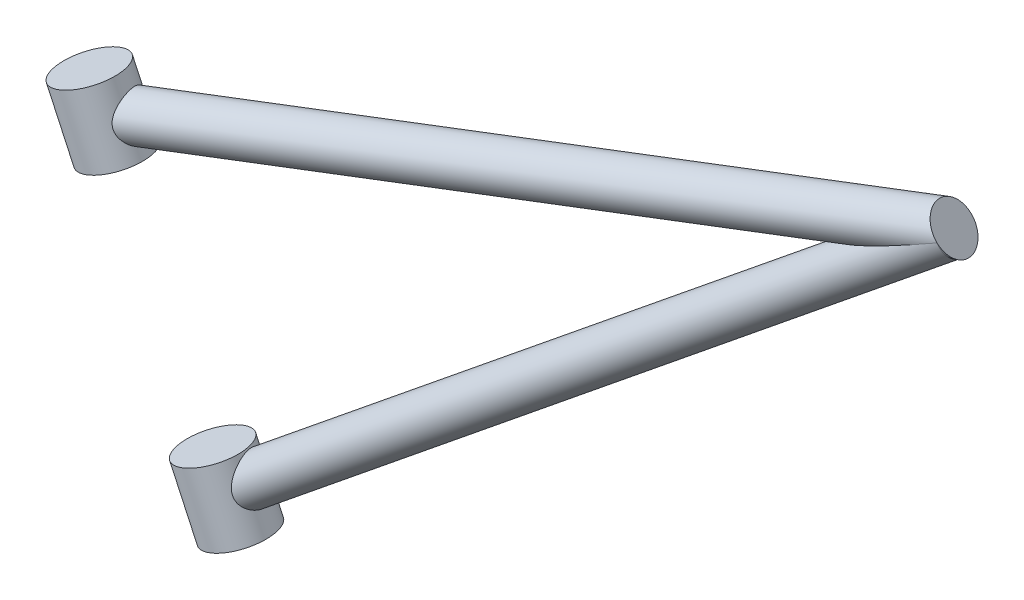
ISO-10303-21;
HEADER;
FILE_DESCRIPTION(('STEP AP214'),'2;1');
FILE_NAME('part.step','',(''),(''),'','','');
FILE_SCHEMA(('AUTOMOTIVE_DESIGN { 1 0 10303 214 1 1 1 1 }'));
ENDSEC;
DATA;
#1=APPLICATION_CONTEXT('core data for automotive mechanical design processes');
#2=APPLICATION_PROTOCOL_DEFINITION('international standard','automotive_design',2000,#1);
#3=PRODUCT_CONTEXT('',#1,'mechanical');
#4=PRODUCT('Part','Part','',(#3));
#5=PRODUCT_RELATED_PRODUCT_CATEGORY('part','',(#4));
#6=PRODUCT_DEFINITION_FORMATION('','',#4);
#7=PRODUCT_DEFINITION_CONTEXT('part definition',#1,'design');
#8=PRODUCT_DEFINITION('design','',#6,#7);
#9=PRODUCT_DEFINITION_SHAPE('','',#8);
#10=(LENGTH_UNIT() NAMED_UNIT(*) SI_UNIT(.MILLI.,.METRE.));
#11=(NAMED_UNIT(*) PLANE_ANGLE_UNIT() SI_UNIT($,.RADIAN.));
#12=(NAMED_UNIT(*) SI_UNIT($,.STERADIAN.) SOLID_ANGLE_UNIT());
#13=UNCERTAINTY_MEASURE_WITH_UNIT(LENGTH_MEASURE(1.E-05),#10,'distance_accuracy_value','');
#14=(GEOMETRIC_REPRESENTATION_CONTEXT(3) GLOBAL_UNCERTAINTY_ASSIGNED_CONTEXT((#13)) GLOBAL_UNIT_ASSIGNED_CONTEXT((#10,
#11,#12)) REPRESENTATION_CONTEXT('',''));
#15=CARTESIAN_POINT('',(0.,0.,0.));
#16=DIRECTION('',(0.,0.,1.));
#17=DIRECTION('',(1.,0.,0.));
#18=AXIS2_PLACEMENT_3D('',#15,#16,#17);
#19=CARTESIAN_POINT('',(255.,1215.1911,-261.859));
#20=DIRECTION('',(0.781537576244063,0.603543584285104,-0.157905537543319));
#21=DIRECTION('',(-0.611211710509564,0.791467147098332,0.));
#22=AXIS2_PLACEMENT_3D('',#19,#20,#21);
#23=CYLINDRICAL_SURFACE('',#22,9.52500000000002);
#24=CARTESIAN_POINT('',(262.838951394775,1233.2793541279,-264.619080925519));
#25=CARTESIAN_POINT('',(262.787488912083,1233.23960963134,-264.845638537802));
#26=CARTESIAN_POINT('',(262.734766156125,1233.18797940243,-265.06985083514));
#27=CARTESIAN_POINT('',(262.627589046774,1233.06237559829,-265.511505984077));
#28=CARTESIAN_POINT('',(262.573134236867,1232.9883960881,-265.728947020594));
#29=CARTESIAN_POINT('',(262.463245126695,1232.81984778192,-266.155704773518));
#30=CARTESIAN_POINT('',(262.407809770882,1232.72525537856,-266.365011847761));
#31=CARTESIAN_POINT('',(262.296778678355,1232.51752027692,-266.774251474919));
#32=CARTESIAN_POINT('',(262.241182874403,1232.40436816687,-266.974179204997));
#33=CARTESIAN_POINT('',(262.131227132889,1232.16299230164,-267.3616645291));
#34=CARTESIAN_POINT('',(262.076860335818,1232.03495700079,-267.549338012237));
#35=CARTESIAN_POINT('',(261.969383342736,1231.76471398586,-267.914445194079));
#36=CARTESIAN_POINT('',(261.916273008021,1231.62250784526,-268.091880026208));
#37=CARTESIAN_POINT('',(261.759709340368,1231.17713819969,-268.608817514082));
#38=CARTESIAN_POINT('',(261.658977139047,1230.85512140389,-268.93311259187));
#39=CARTESIAN_POINT('',(261.491110823488,1230.25058151678,-269.472296117696));
#40=CARTESIAN_POINT('',(261.421548847692,1229.97575906064,-269.695283472507));
#41=CARTESIAN_POINT('',(261.291571045418,1229.40695316772,-270.118656212909));
#42=CARTESIAN_POINT('',(261.231159635429,1229.11296057584,-270.319030672642));
#43=CARTESIAN_POINT('',(261.121714043653,1228.50859368574,-270.698296225301));
#44=CARTESIAN_POINT('',(261.072704182818,1228.19818607108,-270.877141007853));
#45=CARTESIAN_POINT('',(260.988904318178,1227.56427372847,-271.2135274139));
#46=CARTESIAN_POINT('',(260.954110539792,1227.24077250217,-271.37107468476));
#47=CARTESIAN_POINT('',(260.905791214113,1226.63119425343,-271.643640566902));
#48=CARTESIAN_POINT('',(260.889897100657,1226.34657517979,-271.761508464038));
#49=CARTESIAN_POINT('',(260.873247996112,1225.77092711143,-271.981843088168));
#50=CARTESIAN_POINT('',(260.872494086979,1225.47989766009,-272.08430871396));
#51=CARTESIAN_POINT('',(260.888943696537,1224.89390026101,-272.273083975397));
#52=CARTESIAN_POINT('',(260.906102222723,1224.59894400961,-272.359433450916));
#53=CARTESIAN_POINT('',(260.961485556871,1224.00658034386,-272.515333916919));
#54=CARTESIAN_POINT('',(260.999701385954,1223.70917402745,-272.584892049099));
#55=CARTESIAN_POINT('',(261.085868135149,1223.2007674873,-272.688317350928));
#56=CARTESIAN_POINT('',(261.127806290087,1222.98965573423,-272.726688576747));
#57=CARTESIAN_POINT('',(261.225015861238,1222.5689685597,-272.793594100112));
#58=CARTESIAN_POINT('',(261.280283320192,1222.35939270124,-272.822131311126));
#59=CARTESIAN_POINT('',(261.404898040282,1221.9435056547,-272.868644322438));
#60=CARTESIAN_POINT('',(261.474229396097,1221.73719105997,-272.886631964951));
#61=CARTESIAN_POINT('',(261.627401295693,1221.32930061089,-272.911378625542));
#62=CARTESIAN_POINT('',(261.711241743017,1221.12772472506,-272.918137718266));
#63=CARTESIAN_POINT('',(261.893808199368,1220.7298887279,-272.91978693978));
#64=CARTESIAN_POINT('',(261.992620798171,1220.53366793227,-272.914605357723));
#65=CARTESIAN_POINT('',(262.20393287097,1220.14949526974,-272.891723145007));
#66=CARTESIAN_POINT('',(262.316432420639,1219.96154344855,-272.874022445129));
#67=CARTESIAN_POINT('',(262.553762891191,1219.5951669796,-272.825794089136));
#68=CARTESIAN_POINT('',(262.678601412381,1219.41674830942,-272.795258489107));
#69=CARTESIAN_POINT('',(262.938675939501,1219.07049988645,-272.721277667204));
#70=CARTESIAN_POINT('',(263.073911982618,1218.90267017153,-272.677832399154));
#71=CARTESIAN_POINT('',(263.34253341136,1218.58987117151,-272.581752175503));
#72=CARTESIAN_POINT('',(263.475341028139,1218.44412675275,-272.530012796745));
#73=CARTESIAN_POINT('',(263.746392410373,1218.16218181107,-272.415662719547));
#74=CARTESIAN_POINT('',(263.884638252454,1218.02598499031,-272.353047836427));
#75=CARTESIAN_POINT('',(264.164834442923,1217.76306639412,-272.217179290291));
#76=CARTESIAN_POINT('',(264.306784758104,1217.6363445338,-272.143925722614));
#77=CARTESIAN_POINT('',(264.592831545141,1217.39208914233,-271.987011177331));
#78=CARTESIAN_POINT('',(264.736928283074,1217.27455676181,-271.903348899817));
#79=CARTESIAN_POINT('',(265.048974370245,1217.03021072537,-271.711625717096));
#80=CARTESIAN_POINT('',(265.217044038552,1216.90493007947,-271.601803562996));
#81=CARTESIAN_POINT('',(265.552041701595,1216.66574357875,-271.368845679716));
#82=CARTESIAN_POINT('',(265.718969610425,1216.55183857127,-271.245708960189));
#83=CARTESIAN_POINT('',(266.04990651525,1216.33482819055,-270.986416921671));
#84=CARTESIAN_POINT('',(266.213913700874,1216.23172933436,-270.850253840266));
#85=CARTESIAN_POINT('',(266.537179347297,1216.03597662487,-270.565361736146));
#86=CARTESIAN_POINT('',(266.696437604075,1215.94332321984,-270.416632174604));
#87=CARTESIAN_POINT('',(267.032769881571,1215.75455430349,-270.08305163766));
#88=CARTESIAN_POINT('',(267.20878570419,1215.66012292821,-269.896173006199));
#89=CARTESIAN_POINT('',(267.550010294746,1215.4843745235,-269.5069814635));
#90=CARTESIAN_POINT('',(267.71521800719,1215.40305877377,-269.304667049011));
#91=CARTESIAN_POINT('',(268.032625637482,1215.25334266906,-268.885557126569));
#92=CARTESIAN_POINT('',(268.184825695961,1215.18494217445,-268.668761775222));
#93=CARTESIAN_POINT('',(268.474167899431,1215.06097546655,-268.22185970752));
#94=CARTESIAN_POINT('',(268.611310768177,1215.00540863624,-267.991753631783));
#95=CARTESIAN_POINT('',(268.867314361396,1214.90762909878,-267.522141024314));
#96=CARTESIAN_POINT('',(268.986353700318,1214.8652808968,-267.282760208693));
#97=CARTESIAN_POINT('',(269.206288873602,1214.79319294814,-266.793959576144));
#98=CARTESIAN_POINT('',(269.30718462866,1214.76345325658,-266.544539715342));
#99=CARTESIAN_POINT('',(269.489484982285,1214.71665171558,-266.037625969677));
#100=CARTESIAN_POINT('',(269.570897218449,1214.69958489279,-265.780135293513));
#101=CARTESIAN_POINT('',(269.713302590632,1214.67815515319,-265.259057225066));
#102=CARTESIAN_POINT('',(269.774296938499,1214.67379148228,-264.995470195609));
#103=CARTESIAN_POINT('',(269.871839749245,1214.67764071711,-264.482487671243));
#104=CARTESIAN_POINT('',(269.909769232333,1214.68501804567,-264.233346968567));
#105=CARTESIAN_POINT('',(269.967219054953,1214.71079231217,-263.733529520292));
#106=CARTESIAN_POINT('',(269.986740330676,1214.72918868962,-263.482852853462));
#107=CARTESIAN_POINT('',(270.007510545185,1214.77695659943,-262.981813315129));
#108=CARTESIAN_POINT('',(270.008760681925,1214.80632741212,-262.73145042413));
#109=CARTESIAN_POINT('',(269.993416415853,1214.8759933491,-262.232803804385));
#110=CARTESIAN_POINT('',(269.97682166742,1214.91628868497,-261.984520116002));
#111=CARTESIAN_POINT('',(269.92651808642,1215.00767742209,-261.492196146515));
#112=CARTESIAN_POINT('',(269.892841170333,1215.0587505824,-261.248148826442));
#113=CARTESIAN_POINT('',(269.809294962508,1215.171733097,-260.765405356451));
#114=CARTESIAN_POINT('',(269.7594257712,1215.23364238408,-260.526709173355));
#115=CARTESIAN_POINT('',(269.64456330906,1215.36838004246,-260.056027271236));
#116=CARTESIAN_POINT('',(269.579563563451,1215.44121308358,-259.824044472972));
#117=CARTESIAN_POINT('',(269.435705289193,1215.59791936035,-259.368244226412));
#118=CARTESIAN_POINT('',(269.356845925137,1215.68179326142,-259.144427271306));
#119=CARTESIAN_POINT('',(269.180944007928,1215.86684246029,-258.691509887527));
#120=CARTESIAN_POINT('',(269.083035630228,1215.96880167509,-258.463065230749));
#121=CARTESIAN_POINT('',(268.874892178652,1216.18602331427,-258.018417934787));
#122=CARTESIAN_POINT('',(268.764655961191,1216.30128697288,-257.80221643414));
#123=CARTESIAN_POINT('',(268.533931094169,1216.54572350427,-257.383559134057));
#124=CARTESIAN_POINT('',(268.413441976074,1216.67489701279,-257.181103963559));
#125=CARTESIAN_POINT('',(268.164532821564,1216.94788401483,-256.791530222112));
#126=CARTESIAN_POINT('',(268.036114013402,1217.0916952433,-256.604409286397));
#127=CARTESIAN_POINT('',(267.793377314951,1217.37230278892,-256.273652423399));
#128=CARTESIAN_POINT('',(267.679789221619,1217.50698155258,-256.127681330157));
#129=CARTESIAN_POINT('',(267.450556159001,1217.78799825071,-255.849216671703));
#130=CARTESIAN_POINT('',(267.334911580019,1217.93433399075,-255.71672058046));
#131=CARTESIAN_POINT('',(267.103663587377,1218.23882626043,-255.466517963171));
#132=CARTESIAN_POINT('',(266.988060285359,1218.39696868027,-255.348794220479));
#133=CARTESIAN_POINT('',(266.7588792887,1218.72527772479,-255.129146691948));
#134=CARTESIAN_POINT('',(266.64530157164,1218.89544421629,-255.027222731146));
#135=CARTESIAN_POINT('',(266.421479341049,1219.24881295909,-254.839542731904));
#136=CARTESIAN_POINT('',(266.311267533011,1219.43210612179,-254.753918295753));
#137=CARTESIAN_POINT('',(266.097225957495,1219.80964125873,-254.600698634876));
#138=CARTESIAN_POINT('',(265.993396011045,1220.00388292564,-254.533102904379));
#139=CARTESIAN_POINT('',(265.793930023665,1220.4018141094,-254.416416425591));
#140=CARTESIAN_POINT('',(265.698291371447,1220.60550058319,-254.367319762918));
#141=CARTESIAN_POINT('',(265.516420239314,1221.02051539761,-254.287556839996));
#142=CARTESIAN_POINT('',(265.43018744482,1221.23184348235,-254.256889963203));
#143=CARTESIAN_POINT('',(265.277275457421,1221.63490927169,-254.215996479137));
#144=CARTESIAN_POINT('',(265.209489237462,1221.82603248896,-254.203792103287));
#145=CARTESIAN_POINT('',(265.081687940328,1222.21126676639,-254.192682882228));
#146=CARTESIAN_POINT('',(265.021675649567,1222.40537887011,-254.193782792425));
#147=CARTESIAN_POINT('',(264.852872618614,1222.99039638325,-254.215948060444));
#148=CARTESIAN_POINT('',(264.755319345828,1223.38397325166,-254.255879859834));
#149=CARTESIAN_POINT('',(264.603559116246,1224.08622905702,-254.366532715557));
#150=CARTESIAN_POINT('',(264.544549491268,1224.39530774095,-254.428984553368));
#151=CARTESIAN_POINT('',(264.439316417604,1225.00982667488,-254.578516399173));
#152=CARTESIAN_POINT('',(264.393099745884,1225.31526491472,-254.665609411429));
#153=CARTESIAN_POINT('',(264.310585550335,1225.92080879213,-254.862539130422));
#154=CARTESIAN_POINT('',(264.274311459421,1226.22090029962,-254.9724285123));
#155=CARTESIAN_POINT('',(264.209205154447,1226.81322714491,-255.213327325015));
#156=CARTESIAN_POINT('',(264.18037179436,1227.10546368632,-255.344333498377));
#157=CARTESIAN_POINT('',(264.126861571061,1227.6909452326,-255.631676488492));
#158=CARTESIAN_POINT('',(264.102374042528,1227.98384027776,-255.788761346375));
#159=CARTESIAN_POINT('',(264.056593810726,1228.5575828752,-256.124087249875));
#160=CARTESIAN_POINT('',(264.035301525144,1228.838428849,-256.302331055983));
#161=CARTESIAN_POINT('',(263.993886241375,1229.38539599799,-256.679478747211));
#162=CARTESIAN_POINT('',(263.973761568069,1229.65153824033,-256.878351833285));
#163=CARTESIAN_POINT('',(263.932762314084,1230.16680192681,-257.296947853842));
#164=CARTESIAN_POINT('',(263.911887958349,1230.41592841254,-257.516664566066));
#165=CARTESIAN_POINT('',(263.872915779725,1230.83663726232,-257.92185597277));
#166=CARTESIAN_POINT('',(263.855349350688,1231.01250718154,-258.1029383062));
#167=CARTESIAN_POINT('',(263.818002798452,1231.35080736688,-258.47718838374));
#168=CARTESIAN_POINT('',(263.798222058689,1231.51323386774,-258.670359487273));
#169=CARTESIAN_POINT('',(263.75576035649,1231.82240778724,-259.068306187249));
#170=CARTESIAN_POINT('',(263.733082210569,1231.96917018168,-259.273070408007));
#171=CARTESIAN_POINT('',(263.684164838329,1232.24484302067,-259.693768519557));
#172=CARTESIAN_POINT('',(263.657927906659,1232.37376486119,-259.909695157931));
#173=CARTESIAN_POINT('',(263.606649972267,1232.58900319281,-260.310258052099));
#174=CARTESIAN_POINT('',(263.582313730091,1232.67877132676,-260.493132077823));
#175=CARTESIAN_POINT('',(263.53068645592,1232.84360306258,-260.864914890735));
#176=CARTESIAN_POINT('',(263.503396878717,1232.91867385352,-261.053820674684));
#177=CARTESIAN_POINT('',(263.445711659866,1233.05281782878,-261.43665444677));
#178=CARTESIAN_POINT('',(263.415317964201,1233.11190095206,-261.630579232231));
#179=CARTESIAN_POINT('',(263.351351978591,1233.21297617185,-262.022333959908));
#180=CARTESIAN_POINT('',(263.317779882659,1233.25496931072,-262.22016366318));
#181=CARTESIAN_POINT('',(263.250421112757,1233.31824421341,-262.601822384237));
#182=CARTESIAN_POINT('',(263.216880825641,1233.3409492907,-262.785459383674));
#183=CARTESIAN_POINT('',(263.147321471364,1233.37078698005,-263.153518340142));
#184=CARTESIAN_POINT('',(263.111302636942,1233.37792105221,-263.33794022195));
#185=CARTESIAN_POINT('',(263.037005599006,1233.37647469225,-263.7062967006));
#186=CARTESIAN_POINT('',(262.998727061325,1233.36789193025,-263.890231221147));
#187=CARTESIAN_POINT('',(262.920216736431,1233.33517773641,-264.256301321555));
#188=CARTESIAN_POINT('',(262.879984679328,1233.31104415045,-264.43843664864));
#189=CARTESIAN_POINT('',(262.838951394775,1233.2793541279,-264.619080925519));
#190=B_SPLINE_CURVE_WITH_KNOTS('',3,(#24,#25,#26,#27,#28,#29,#30,#31,#32,#33,#34,#35,#36,#37,
#38,#39,#40,#41,#42,#43,#44,#45,#46,#47,#48,#49,#50,#51,#52,#53,#54,#55,#56,#57,#58,#59,#60,#61,
#62,#63,#64,#65,#66,#67,#68,#69,#70,#71,#72,#73,#74,#75,#76,#77,#78,#79,#80,#81,#82,#83,#84,#85,
#86,#87,#88,#89,#90,#91,#92,#93,#94,#95,#96,#97,#98,#99,#100,#101,#102,#103,#104,#105,#106,#107,
#108,#109,#110,#111,#112,#113,#114,#115,#116,#117,#118,#119,#120,#121,#122,#123,#124,#125,#126,
#127,#128,#129,#130,#131,#132,#133,#134,#135,#136,#137,#138,#139,#140,#141,#142,#143,#144,#145,
#146,#147,#148,#149,#150,#151,#152,#153,#154,#155,#156,#157,#158,#159,#160,#161,#162,#163,#164,
#165,#166,#167,#168,#169,#170,#171,#172,#173,#174,#175,#176,#177,#178,#179,#180,#181,#182,#183,
#184,#185,#186,#187,#188,#189),.UNSPECIFIED.,.T.,.F.,(4,2,2,2,2,2,2,2,2,2,2,2,2,2,2,2,2,2,2,2,2,
2,2,2,2,2,2,2,2,2,2,2,2,2,2,2,2,2,2,2,2,2,2,2,2,2,2,2,2,2,2,2,2,2,2,2,2,2,2,2,2,2,2,2,2,2,2,2,2,
2,2,2,2,2,2,2,2,2,2,2,2,2,4),(0.,0.706867703805031,1.4139232851994,2.12179293388452,
2.83002266507531,3.53010110138962,4.2301018893239,5.6295241835048,6.71032866882562,
7.79165314992583,8.87526350567644,9.95858595939272,10.8832483239009,11.8079767667699,
12.7303880499603,13.6524063190207,14.3077440869664,14.9628875344211,15.617294148631,
16.2716964124894,16.9300389847291,17.5883851970146,18.2471394813914,18.9058961220553,
19.5168518591243,20.1280432028951,20.7392290697808,21.3504913423179,22.0597535021418,
22.7690684537149,23.4788087509051,24.1885794958715,25.0082174863642,25.8279354014961,
26.6476444531449,27.4673140865753,28.278282793382,29.0892550447529,29.8999088699604,
30.7105145724803,31.4659620457393,32.221371096927,32.9767306192732,33.7321047717538,
34.4860727464939,35.2400360449529,35.9943225799192,36.7486545960793,37.5536807582735,
38.3587816602948,39.1639193733671,39.96893268765,40.6546746185071,41.3402877619278,
42.0250942758878,42.7098932059011,43.4000062371711,44.0900999062315,44.7799727561764,
45.4698225260783,46.0786445814971,46.6876842570772,47.9057946040425,48.8670145492772,
49.8287427229667,50.7927184033327,51.7565455228858,52.7554305464275,53.7544460324934,
54.7519909114059,55.7492389338123,56.5077820881865,57.2665369830313,58.024559840044,
58.7820962390697,59.3970169754651,60.0116361732986,60.6258724021526,61.2400711614882,
61.8035788767184,62.3670337497585,62.9305721565556,63.4941886420775),.UNSPECIFIED.);
#191=CARTESIAN_POINT('',(262.838951394775,1233.2793541279,-264.619080925519));
#192=VERTEX_POINT('',#191);
#193=EDGE_CURVE('E80',#192,#192,#190,.T.);
#194=ORIENTED_EDGE('',*,*,#193,.F.);
#195=EDGE_LOOP('',(#194));
#196=FACE_BOUND('',#195,.T.);
#197=CARTESIAN_POINT('',(519.692129,1419.6,-315.338646));
#198=DIRECTION('',(0.883977158036266,0.432175870584589,-0.178349098552753));
#199=DIRECTION('',(-0.423857121616073,0.901788794577755,0.0843925970055212));
#200=AXIS2_PLACEMENT_3D('',#197,#198,#199);
#201=ELLIPSE('',#200,9.72076999108081,9.52500000000002);
#202=CARTESIAN_POINT('',(521.571465437024,1419.60946220639,-306.000893057074));
#203=VERTEX_POINT('',#202);
#204=CARTESIAN_POINT('',(517.812792562976,1419.59053779361,-324.676398942926));
#205=VERTEX_POINT('',#204);
#206=EDGE_CURVE('E86',#203,#205,#201,.T.);
#207=ORIENTED_EDGE('',*,*,#206,.F.);
#208=CARTESIAN_POINT('',(519.692129,1419.6,-315.338646));
#209=DIRECTION('',(-0.423857121616073,0.901788794577755,0.0843925970055212));
#210=DIRECTION('',(0.883977158036266,0.432175870584589,-0.178349098552753));
#211=AXIS2_PLACEMENT_3D('',#208,#209,#210);
#212=ELLIPSE('',#211,47.7007212097638,9.52500000000002);
#213=EDGE_CURVE('E93',#205,#203,#212,.T.);
#214=ORIENTED_EDGE('',*,*,#213,.F.);
#215=EDGE_LOOP('',(#207,#214));
#216=FACE_BOUND('',#215,.T.);
#217=ADVANCED_FACE('F67',(#196,#216),#23,.T.);
#218=CARTESIAN_POINT('',(210.,1340.3211,-252.929));
#219=DIRECTION('',(0.950811288716433,0.243400674471197,-0.191608989654355));
#220=DIRECTION('',(-0.247995702030152,0.968761132464847,0.));
#221=AXIS2_PLACEMENT_3D('',#218,#219,#220);
#222=CYLINDRICAL_SURFACE('',#221,9.52500000000001);
#223=CARTESIAN_POINT('',(220.058204559034,1352.7280712316,-255.431971254945));
#224=CARTESIAN_POINT('',(220.005392407876,1352.71455144215,-255.675172910199));
#225=CARTESIAN_POINT('',(219.949672265575,1352.69018530344,-255.917143478642));
#226=CARTESIAN_POINT('',(219.833046118016,1352.62013831825,-256.39670499037));
#227=CARTESIAN_POINT('',(219.772139958358,1352.57445683697,-256.634295803002));
#228=CARTESIAN_POINT('',(219.645920561364,1352.46244175126,-257.103442969339));
#229=CARTESIAN_POINT('',(219.580605725039,1352.39610062189,-257.334997090919));
#230=CARTESIAN_POINT('',(219.446526771884,1352.24369646172,-257.790473249095));
#231=CARTESIAN_POINT('',(219.377762638219,1352.15763333467,-258.014395248434));
#232=CARTESIAN_POINT('',(219.238152903468,1351.96732190144,-258.452335223492));
#233=CARTESIAN_POINT('',(219.167318452729,1351.86315991026,-258.666394367089));
#234=CARTESIAN_POINT('',(219.024370701445,1351.63754980802,-259.084730389211));
#235=CARTESIAN_POINT('',(218.95225740569,1351.51610176169,-259.289007304363));
#236=CARTESIAN_POINT('',(218.80791696967,1351.25710947308,-259.687039301059));
#237=CARTESIAN_POINT('',(218.735689824844,1351.11956456897,-259.880793949491));
#238=CARTESIAN_POINT('',(218.592323756214,1350.82949416685,-260.257301479708));
#239=CARTESIAN_POINT('',(218.521185343198,1350.6769618722,-260.440049308842));
#240=CARTESIAN_POINT('',(218.375522541186,1350.34484400541,-260.808751035792));
#241=CARTESIAN_POINT('',(218.301207227216,1350.1640637983,-260.993711963489));
#242=CARTESIAN_POINT('',(218.157218489466,1349.7877044449,-261.349718042994));
#243=CARTESIAN_POINT('',(218.08754359691,1349.5921300235,-261.520767601828));
#244=CARTESIAN_POINT('',(217.954703437273,1349.18722979448,-261.848850061838));
#245=CARTESIAN_POINT('',(217.891542898309,1348.97789417692,-262.005872771416));
#246=CARTESIAN_POINT('',(217.773957326803,1348.54681174873,-262.305476071761));
#247=CARTESIAN_POINT('',(217.719531492785,1348.32506607935,-262.44805798714));
#248=CARTESIAN_POINT('',(217.62610080119,1347.8902248545,-262.706667530965));
#249=CARTESIAN_POINT('',(217.58616497513,1347.67806165785,-262.823926552921));
#250=CARTESIAN_POINT('',(217.517641775494,1347.24547027295,-263.045822049763));
#251=CARTESIAN_POINT('',(217.489052621751,1347.02504338712,-263.150460502883));
#252=CARTESIAN_POINT('',(217.445450691621,1346.57742877994,-263.346593891321));
#253=CARTESIAN_POINT('',(217.430420072762,1346.35025035145,-263.438105966566));
#254=CARTESIAN_POINT('',(217.416140707708,1345.89041987804,-263.607637111161));
#255=CARTESIAN_POINT('',(217.416888555101,1345.6577690254,-263.68565908922));
#256=CARTESIAN_POINT('',(217.434613959073,1345.22920834433,-263.815464665237));
#257=CARTESIAN_POINT('',(217.448783051929,1345.03384824855,-263.869453243242));
#258=CARTESIAN_POINT('',(217.490386948374,1344.64206120882,-263.96748131118));
#259=CARTESIAN_POINT('',(217.517818985011,1344.44563449583,-264.011522873476));
#260=CARTESIAN_POINT('',(217.586579294778,1344.05335858349,-264.089368398399));
#261=CARTESIAN_POINT('',(217.627895201597,1343.85750902611,-264.123181420799));
#262=CARTESIAN_POINT('',(217.724638422249,1343.46778150501,-264.180455543878));
#263=CARTESIAN_POINT('',(217.780065952849,1343.27390357163,-264.203916485526));
#264=CARTESIAN_POINT('',(217.90473211486,1342.88964220682,-264.240446639979));
#265=CARTESIAN_POINT('',(217.973970964075,1342.69925883054,-264.253515688889));
#266=CARTESIAN_POINT('',(218.125470575064,1342.32332440926,-264.269361137485));
#267=CARTESIAN_POINT('',(218.207731232219,1342.13777332544,-264.272137619858));
#268=CARTESIAN_POINT('',(218.38418773323,1341.77237079285,-264.267613183625));
#269=CARTESIAN_POINT('',(218.47839460498,1341.59252480487,-264.260302891219));
#270=CARTESIAN_POINT('',(218.677316712219,1341.23933571464,-264.235878308205));
#271=CARTESIAN_POINT('',(218.78203795424,1341.06599640802,-264.218758387077));
#272=CARTESIAN_POINT('',(219.035655987962,1340.67155571323,-264.167980659465));
#273=CARTESIAN_POINT('',(219.187912960041,1340.45306508909,-264.130771195546));
#274=CARTESIAN_POINT('',(219.504679226834,1340.02858372262,-264.040459657719));
#275=CARTESIAN_POINT('',(219.669193506108,1339.82259812807,-263.987351091488));
#276=CARTESIAN_POINT('',(220.007514257624,1339.42271627448,-263.865721443));
#277=CARTESIAN_POINT('',(220.181333605791,1339.22883761594,-263.797178560032));
#278=CARTESIAN_POINT('',(220.535226801556,1338.85311743009,-263.645105031879));
#279=CARTESIAN_POINT('',(220.715300171259,1338.67127498611,-263.561575529863));
#280=CARTESIAN_POINT('',(221.083909847454,1338.31468170034,-263.377381454226));
#281=CARTESIAN_POINT('',(221.272544787306,1338.14023168271,-263.276332880884));
#282=CARTESIAN_POINT('',(221.651429222478,1337.80318671311,-263.058685742175));
#283=CARTESIAN_POINT('',(221.841678774586,1337.64059218007,-262.942086627735));
#284=CARTESIAN_POINT('',(222.22149985588,1337.32715573058,-262.693282170819));
#285=CARTESIAN_POINT('',(222.411071624119,1337.176309177,-262.561083038317));
#286=CARTESIAN_POINT('',(222.787473297266,1336.88634326458,-262.280857726494));
#287=CARTESIAN_POINT('',(222.974303293541,1336.74722351422,-262.132832075948));
#288=CARTESIAN_POINT('',(223.34090890905,1336.48254502107,-261.82258569817));
#289=CARTESIAN_POINT('',(223.520741705866,1336.35684582294,-261.660552751031));
#290=CARTESIAN_POINT('',(223.873504086644,1336.11763370838,-261.320677971994));
#291=CARTESIAN_POINT('',(224.046433395195,1336.00412127784,-261.142835510294));
#292=CARTESIAN_POINT('',(224.382981454466,1335.79006509206,-260.771502782858));
#293=CARTESIAN_POINT('',(224.546607374458,1335.68951127298,-260.578024852184));
#294=CARTESIAN_POINT('',(224.862281348129,1335.50215433677,-260.17557996824));
#295=CARTESIAN_POINT('',(225.014331756029,1335.4153484197,-259.966616181629));
#296=CARTESIAN_POINT('',(225.279177946407,1335.27028108763,-259.571440249272));
#297=CARTESIAN_POINT('',(225.394205266253,1335.20968049955,-259.387578631088));
#298=CARTESIAN_POINT('',(225.613239184441,1335.09914290573,-259.010345242543));
#299=CARTESIAN_POINT('',(225.717247851146,1335.04920389688,-258.816975267052));
#300=CARTESIAN_POINT('',(225.912838602288,1334.96058012592,-258.421679023298));
#301=CARTESIAN_POINT('',(226.004427258667,1334.92188939939,-258.219757354908));
#302=CARTESIAN_POINT('',(226.173993160084,1334.85623559646,-257.808409527615));
#303=CARTESIAN_POINT('',(226.251970262957,1334.82927264256,-257.598983290358));
#304=CARTESIAN_POINT('',(226.393550318186,1334.78738129725,-257.173165021181));
#305=CARTESIAN_POINT('',(226.457092197528,1334.77250337675,-256.95674766115));
#306=CARTESIAN_POINT('',(226.568598417498,1334.75520381533,-256.519442124876));
#307=CARTESIAN_POINT('',(226.616562728996,1334.7527821977,-256.298553940274));
#308=CARTESIAN_POINT('',(226.696469822303,1334.76043561394,-255.854111517752));
#309=CARTESIAN_POINT('',(226.728412331943,1334.77051086009,-255.63055723461));
#310=CARTESIAN_POINT('',(226.776200055963,1334.80300092097,-255.182638925855));
#311=CARTESIAN_POINT('',(226.792045757327,1334.82541536237,-254.958274924945));
#312=CARTESIAN_POINT('',(226.807420525618,1334.88041591257,-254.524936665422));
#313=CARTESIAN_POINT('',(226.807933407207,1334.9122551564,-254.315900636444));
#314=CARTESIAN_POINT('',(226.79561140915,1334.98606462093,-253.89996174686));
#315=CARTESIAN_POINT('',(226.782771962035,1335.02803830457,-253.69305964067));
#316=CARTESIAN_POINT('',(226.744420369864,1335.12164999429,-253.282687642859));
#317=CARTESIAN_POINT('',(226.718910226411,1335.17328647312,-253.07921721438));
#318=CARTESIAN_POINT('',(226.656049269499,1335.28574175814,-252.676662402281));
#319=CARTESIAN_POINT('',(226.618694098146,1335.34656393951,-252.477579661807));
#320=CARTESIAN_POINT('',(226.482441763304,1335.55388243483,-251.852691857103));
#321=CARTESIAN_POINT('',(226.362942017377,1335.7167775333,-251.436590391437));
#322=CARTESIAN_POINT('',(226.082030017462,1336.07934673218,-250.636130702453));
#323=CARTESIAN_POINT('',(225.920606398694,1336.27903080112,-250.251781123774));
#324=CARTESIAN_POINT('',(225.636762335436,1336.62565340611,-249.665013680764));
#325=CARTESIAN_POINT('',(225.524458133929,1336.76187159129,-249.451165715667));
#326=CARTESIAN_POINT('',(225.290409860069,1337.04621465666,-249.036900627955));
#327=CARTESIAN_POINT('',(225.16866473618,1337.19434086325,-248.836485006092));
#328=CARTESIAN_POINT('',(224.917530444045,1337.50271761262,-248.449327992636));
#329=CARTESIAN_POINT('',(224.788123469323,1337.66299666256,-248.262620909734));
#330=CARTESIAN_POINT('',(224.524037951141,1337.99547411669,-247.904140154608));
#331=CARTESIAN_POINT('',(224.389359272193,1338.16767282732,-247.732366866564));
#332=CARTESIAN_POINT('',(224.093481472431,1338.55496975623,-247.37645571703));
#333=CARTESIAN_POINT('',(223.931703479246,1338.77235375684,-247.195268901469));
#334=CARTESIAN_POINT('',(223.60769253784,1339.22469181042,-246.856477745664));
#335=CARTESIAN_POINT('',(223.445459461229,1339.45965143231,-246.698880927917));
#336=CARTESIAN_POINT('',(223.125469689868,1339.94693919771,-246.410368762245));
#337=CARTESIAN_POINT('',(222.967699599225,1340.19920528166,-246.279364127062));
#338=CARTESIAN_POINT('',(222.661017694209,1340.72190108457,-246.046639963052));
#339=CARTESIAN_POINT('',(222.512098337682,1340.99231490803,-245.944895208094));
#340=CARTESIAN_POINT('',(222.281047047807,1341.44650927626,-245.805935489851));
#341=CARTESIAN_POINT('',(222.194663226567,1341.62513557204,-245.758791485306));
#342=CARTESIAN_POINT('',(222.028655243883,1341.98850793336,-245.678291820282));
#343=CARTESIAN_POINT('',(221.949028960132,1342.17325205197,-245.644931817896));
#344=CARTESIAN_POINT('',(221.79768803214,1342.54772685426,-245.592740824786));
#345=CARTESIAN_POINT('',(221.725964606669,1342.73745170723,-245.573893565887));
#346=CARTESIAN_POINT('',(221.591120470369,1343.12083171554,-245.551147596085));
#347=CARTESIAN_POINT('',(221.528000062282,1343.31448700892,-245.547249411115));
#348=CARTESIAN_POINT('',(221.410743899208,1343.7043676231,-245.554582735125));
#349=CARTESIAN_POINT('',(221.356614751408,1343.90059472055,-245.565825315459));
#350=CARTESIAN_POINT('',(221.257392263565,1344.29388312877,-245.603306940601));
#351=CARTESIAN_POINT('',(221.212298831549,1344.49094443103,-245.629545832751));
#352=CARTESIAN_POINT('',(221.130686996937,1344.88460215803,-245.696623801045));
#353=CARTESIAN_POINT('',(221.094179357878,1345.0811976966,-245.737481043407));
#354=CARTESIAN_POINT('',(221.029070312744,1345.47230429023,-245.833149869254));
#355=CARTESIAN_POINT('',(221.0004706372,1345.66681488009,-245.887964502054));
#356=CARTESIAN_POINT('',(220.943746590878,1346.10235614483,-246.026667167403));
#357=CARTESIAN_POINT('',(220.91765230391,1346.34242834972,-246.114407646529));
#358=CARTESIAN_POINT('',(220.874360333364,1346.81541094311,-246.30924891905));
#359=CARTESIAN_POINT('',(220.857164993926,1347.04831942938,-246.416354803616));
#360=CARTESIAN_POINT('',(220.829489514856,1347.50565403249,-246.648571124493));
#361=CARTESIAN_POINT('',(220.819016065122,1347.73007149038,-246.77369934623));
#362=CARTESIAN_POINT('',(220.802746913124,1348.16892631553,-247.040576978901));
#363=CARTESIAN_POINT('',(220.7969509646,1348.38336420762,-247.182325514363));
#364=CARTESIAN_POINT('',(220.788072547212,1348.80455002335,-247.48373514529));
#365=CARTESIAN_POINT('',(220.785035218459,1349.01111880201,-247.643647663463));
#366=CARTESIAN_POINT('',(220.780047509471,1349.41183009337,-247.978514758798));
#367=CARTESIAN_POINT('',(220.778097568116,1349.60596756075,-248.153475376676));
#368=CARTESIAN_POINT('',(220.773686181646,1349.98062324631,-248.5174534864));
#369=CARTESIAN_POINT('',(220.771224689518,1350.16114021067,-248.706472269204));
#370=CARTESIAN_POINT('',(220.76436326109,1350.50726980603,-249.097534434081));
#371=CARTESIAN_POINT('',(220.759964084947,1350.67288825111,-249.299572682087));
#372=CARTESIAN_POINT('',(220.747218792165,1351.00732715284,-249.741250035118));
#373=CARTESIAN_POINT('',(220.738455626585,1351.17406022021,-249.982465212251));
#374=CARTESIAN_POINT('',(220.715310538215,1351.48535167629,-250.478614270988));
#375=CARTESIAN_POINT('',(220.700927986483,1351.62990758035,-250.733549685454));
#376=CARTESIAN_POINT('',(220.665245785216,1351.89474382234,-251.255026373407));
#377=CARTESIAN_POINT('',(220.643952141794,1352.01504509222,-251.521557396145));
#378=CARTESIAN_POINT('',(220.5934201682,1352.22959493552,-252.064164104054));
#379=CARTESIAN_POINT('',(220.564183806137,1352.32384995121,-252.340237409993));
#380=CARTESIAN_POINT('',(220.503091313359,1352.47025584779,-252.849305396603));
#381=CARTESIAN_POINT('',(220.472637777578,1352.52692135312,-253.081178710934));
#382=CARTESIAN_POINT('',(220.405735622742,1352.62080867398,-253.547967059227));
#383=CARTESIAN_POINT('',(220.369287836916,1352.6580331889,-253.78288166626));
#384=CARTESIAN_POINT('',(220.290413030263,1352.71250322977,-254.253926742571));
#385=CARTESIAN_POINT('',(220.247988390301,1352.72975668605,-254.490056691808));
#386=CARTESIAN_POINT('',(220.157345427358,1352.74405922887,-254.961829714848));
#387=CARTESIAN_POINT('',(220.109126786049,1352.74110720481,-255.197472761177));
#388=CARTESIAN_POINT('',(220.058204559034,1352.7280712316,-255.431971254945));
#389=B_SPLINE_CURVE_WITH_KNOTS('',3,(#223,#224,#225,#226,#227,#228,#229,#230,#231,#232,#233,
#234,#235,#236,#237,#238,#239,#240,#241,#242,#243,#244,#245,#246,#247,#248,#249,#250,#251,#252,
#253,#254,#255,#256,#257,#258,#259,#260,#261,#262,#263,#264,#265,#266,#267,#268,#269,#270,#271,
#272,#273,#274,#275,#276,#277,#278,#279,#280,#281,#282,#283,#284,#285,#286,#287,#288,#289,#290,
#291,#292,#293,#294,#295,#296,#297,#298,#299,#300,#301,#302,#303,#304,#305,#306,#307,#308,#309,
#310,#311,#312,#313,#314,#315,#316,#317,#318,#319,#320,#321,#322,#323,#324,#325,#326,#327,#328,
#329,#330,#331,#332,#333,#334,#335,#336,#337,#338,#339,#340,#341,#342,#343,#344,#345,#346,#347,
#348,#349,#350,#351,#352,#353,#354,#355,#356,#357,#358,#359,#360,#361,#362,#363,#364,#365,#366,
#367,#368,#369,#370,#371,#372,#373,#374,#375,#376,#377,#378,#379,#380,#381,#382,#383,#384,#385,
#386,#387,#388),.UNSPECIFIED.,.T.,.F.,(4,2,2,2,2,2,2,2,2,2,2,2,2,2,2,2,2,2,2,2,2,2,2,2,2,2,2,2,
2,2,2,2,2,2,2,2,2,2,2,2,2,2,2,2,2,2,2,2,2,2,2,2,2,2,2,2,2,2,2,2,2,2,2,2,2,2,2,2,2,2,2,2,2,2,2,2,
2,2,2,2,2,2,4),(0.,0.74746534356985,1.49495294907905,2.24271313397561,2.99047696868689,
3.73476791500564,4.47905607420461,5.22337484623519,5.9680327317801,6.77450062588038,
7.58071203324069,8.3875045308073,9.19422295653243,9.93058129142176,10.6668240541246,
11.4020965323961,12.1372102743686,12.7461149993172,13.3548927476102,13.9631296907926,
14.5713759775516,15.1796318570372,15.7878828499565,16.3966994810848,17.0058659107373,
17.8113520675625,18.617167590534,19.4241285345955,20.2310279504625,21.0585892492404,
21.8861797760251,22.7134419642091,23.5406765215669,24.3581652823375,25.1756866239193,
25.9925691913781,26.8092851753307,27.4841753372534,28.1589385870908,28.8333433867686,
29.5077552298065,30.1849693537673,30.8621847441383,31.5394116382383,32.2166180433301,
32.8502720630975,33.4841429100314,34.117913655611,34.7519178422672,36.1341333650942,
37.5167239725429,38.3479734323399,39.1793156106283,40.0126720972107,40.8460500159283,
41.8226977787928,42.7996563195607,43.77327824289,44.7460582333949,45.3572965186321,
45.9683421191735,46.5787017621702,47.1890828783897,47.7999105648757,48.4107320334312,
49.0223152211909,49.6340321383023,50.4037223977884,51.1736153040975,51.9442732557982,
52.7148906315236,53.4979018518433,54.2812288744111,55.0646279187236,55.8477199075793,
56.7266216564205,57.6056218032005,58.4838600875135,59.3618809532732,60.0829445847264,
60.8039080695978,61.52458516836,62.2453018798824),.UNSPECIFIED.);
#390=CARTESIAN_POINT('',(220.058204559034,1352.7280712316,-255.431971254945));
#391=VERTEX_POINT('',#390);
#392=EDGE_CURVE('E12',#391,#391,#389,.T.);
#393=ORIENTED_EDGE('',*,*,#392,.F.);
#394=EDGE_LOOP('',(#393));
#395=FACE_BOUND('',#394,.T.);
#396=CARTESIAN_POINT('',(519.692129,1419.6,-315.338646));
#397=DIRECTION('',(0.781537576244064,0.603543584285104,-0.157905537543319));
#398=DIRECTION('',(0.591835697126398,-0.797329389280138,-0.118306181567454));
#399=AXIS2_PLACEMENT_3D('',#396,#397,#398);
#400=ELLIPSE('',#399,10.3504056646411,9.52500000000001);
#401=EDGE_CURVE('E91',#203,#205,#400,.F.);
#402=ORIENTED_EDGE('',*,*,#401,.T.);
#403=ORIENTED_EDGE('',*,*,#213,.T.);
#404=EDGE_LOOP('',(#402,#403));
#405=FACE_BOUND('',#404,.T.);
#406=ADVANCED_FACE('F92',(#395,#405),#222,.T.);
#407=EDGE_CURVE('E97',#205,#203,#400,.F.);
#408=ORIENTED_EDGE('',*,*,#407,.T.);
#409=ORIENTED_EDGE('',*,*,#206,.T.);
#410=EDGE_LOOP('',(#408,#409));
#411=FACE_BOUND('',#410,.T.);
#412=ADVANCED_FACE('F102',(#411),#222,.T.);
#413=CARTESIAN_POINT('',(519.692129,1419.6,-315.338646));
#414=DIRECTION('',(0.781537576244064,0.603543584285104,-0.157905537543319));
#415=DIRECTION('',(-0.611211710509564,0.791467147098332,0.));
#416=AXIS2_PLACEMENT_3D('',#413,#414,#415);
#417=PLANE('',#416);
#418=ORIENTED_EDGE('',*,*,#401,.F.);
#419=ORIENTED_EDGE('',*,*,#407,.F.);
#420=EDGE_LOOP('',(#418,#419));
#421=FACE_BOUND('',#420,.T.);
#422=ADVANCED_FACE('F69',(#421),#417,.T.);
#423=CARTESIAN_POINT('',(260.064711,1201.10783,-262.864064));
#424=DIRECTION('',(-0.337647441230119,0.938884781313859,0.0670042748485544));
#425=DIRECTION('',(-0.94099950043385,-0.338407949349961,0.));
#426=AXIS2_PLACEMENT_3D('',#423,#424,#425);
#427=PLANE('',#426);
#428=CARTESIAN_POINT('',(260.064711,1201.10783,-262.864064));
#429=DIRECTION('',(-0.337647441230119,0.938884781313859,0.0670042748485544));
#430=DIRECTION('',(-0.94099950043385,-0.338407949349961,0.));
#431=AXIS2_PLACEMENT_3D('',#428,#429,#430);
#432=CIRCLE('',#431,14.);
#433=CARTESIAN_POINT('',(246.890717993926,1196.3701187091,-262.864064));
#434=VERTEX_POINT('',#433);
#435=EDGE_CURVE('E148',#434,#434,#432,.T.);
#436=ORIENTED_EDGE('',*,*,#435,.F.);
#437=EDGE_LOOP('',(#436));
#438=FACE_BOUND('',#437,.T.);
#439=ADVANCED_FACE('F121',(#438),#427,.F.);
#440=CARTESIAN_POINT('',(249.935289,1229.27437,-260.853936));
#441=DIRECTION('',(-0.337647441230119,0.938884781313859,0.0670042748485544));
#442=DIRECTION('',(-0.94099950043385,-0.338407949349961,0.));
#443=AXIS2_PLACEMENT_3D('',#440,#441,#442);
#444=PLANE('',#443);
#445=CARTESIAN_POINT('',(249.935289,1229.27437,-260.853936));
#446=DIRECTION('',(-0.337647441230119,0.938884781313859,0.0670042748485544));
#447=DIRECTION('',(-0.94099950043385,-0.338407949349961,0.));
#448=AXIS2_PLACEMENT_3D('',#445,#446,#447);
#449=CIRCLE('',#448,14.);
#450=CARTESIAN_POINT('',(236.761295993926,1224.5366587091,-260.853936));
#451=VERTEX_POINT('',#450);
#452=EDGE_CURVE('E101',#451,#451,#449,.T.);
#453=ORIENTED_EDGE('',*,*,#452,.T.);
#454=EDGE_LOOP('',(#453));
#455=FACE_BOUND('',#454,.T.);
#456=ADVANCED_FACE('F116',(#455),#444,.T.);
#457=CARTESIAN_POINT('',(260.064711,1201.10783,-262.864064));
#458=DIRECTION('',(-0.337647441230119,0.938884781313859,0.0670042748485567));
#459=DIRECTION('',(-0.940999500433849,-0.338407949349961,0.));
#460=AXIS2_PLACEMENT_3D('',#457,#458,#459);
#461=CYLINDRICAL_SURFACE('',#460,14.);
#462=ORIENTED_EDGE('',*,*,#193,.T.);
#463=EDGE_LOOP('',(#462));
#464=FACE_BOUND('',#463,.T.);
#465=ORIENTED_EDGE('',*,*,#452,.F.);
#466=EDGE_LOOP('',(#465));
#467=FACE_BOUND('',#466,.T.);
#468=ORIENTED_EDGE('',*,*,#435,.T.);
#469=EDGE_LOOP('',(#468));
#470=FACE_BOUND('',#469,.T.);
#471=ADVANCED_FACE('F110',(#464,#467,#470),#461,.T.);
#472=CARTESIAN_POINT('',(215.064711,1326.23783,-253.934064));
#473=DIRECTION('',(-0.337647441230126,0.938884781313856,0.0670042748485613));
#474=DIRECTION('',(-0.940999500433847,-0.338407949349968,0.));
#475=AXIS2_PLACEMENT_3D('',#472,#473,#474);
#476=PLANE('',#475);
#477=CARTESIAN_POINT('',(215.064711,1326.23783,-253.934064));
#478=DIRECTION('',(-0.337647441230126,0.938884781313856,0.0670042748485613));
#479=DIRECTION('',(-0.940999500433847,-0.338407949349968,0.));
#480=AXIS2_PLACEMENT_3D('',#477,#478,#479);
#481=CIRCLE('',#480,14.);
#482=CARTESIAN_POINT('',(201.890717993926,1321.5001187091,-253.934064));
#483=VERTEX_POINT('',#482);
#484=EDGE_CURVE('E145',#483,#483,#481,.T.);
#485=ORIENTED_EDGE('',*,*,#484,.F.);
#486=EDGE_LOOP('',(#485));
#487=FACE_BOUND('',#486,.T.);
#488=ADVANCED_FACE('F115',(#487),#476,.F.);
#489=CARTESIAN_POINT('',(204.935289,1354.40437,-251.923936));
#490=DIRECTION('',(-0.337647441230126,0.938884781313856,0.0670042748485613));
#491=DIRECTION('',(-0.940999500433847,-0.338407949349968,0.));
#492=AXIS2_PLACEMENT_3D('',#489,#490,#491);
#493=PLANE('',#492);
#494=CARTESIAN_POINT('',(204.935289,1354.40437,-251.923936));
#495=DIRECTION('',(-0.337647441230126,0.938884781313856,0.0670042748485613));
#496=DIRECTION('',(-0.940999500433847,-0.338407949349968,0.));
#497=AXIS2_PLACEMENT_3D('',#494,#495,#496);
#498=CIRCLE('',#497,14.);
#499=CARTESIAN_POINT('',(191.761295993926,1349.6666587091,-251.923936));
#500=VERTEX_POINT('',#499);
#501=EDGE_CURVE('E142',#500,#500,#498,.T.);
#502=ORIENTED_EDGE('',*,*,#501,.T.);
#503=EDGE_LOOP('',(#502));
#504=FACE_BOUND('',#503,.T.);
#505=ADVANCED_FACE('F138',(#504),#493,.T.);
#506=CARTESIAN_POINT('',(215.064711,1326.23783,-253.934064));
#507=DIRECTION('',(-0.337647441230119,0.938884781313859,0.0670042748485567));
#508=DIRECTION('',(-0.940999500433849,-0.338407949349961,0.));
#509=AXIS2_PLACEMENT_3D('',#506,#507,#508);
#510=CYLINDRICAL_SURFACE('',#509,14.);
#511=ORIENTED_EDGE('',*,*,#392,.T.);
#512=EDGE_LOOP('',(#511));
#513=FACE_BOUND('',#512,.T.);
#514=ORIENTED_EDGE('',*,*,#501,.F.);
#515=EDGE_LOOP('',(#514));
#516=FACE_BOUND('',#515,.T.);
#517=ORIENTED_EDGE('',*,*,#484,.T.);
#518=EDGE_LOOP('',(#517));
#519=FACE_BOUND('',#518,.T.);
#520=ADVANCED_FACE('F125',(#513,#516,#519),#510,.T.);
#521=CLOSED_SHELL('',(#217,#406,#412,#422,#439,#456,#471,#488,#505,#520));
#522=MANIFOLD_SOLID_BREP('B2',#521);
#523=ADVANCED_BREP_SHAPE_REPRESENTATION('',(#18,#522),#14);
#524=SHAPE_DEFINITION_REPRESENTATION(#9,#523);
ENDSEC;
END-ISO-10303-21;
